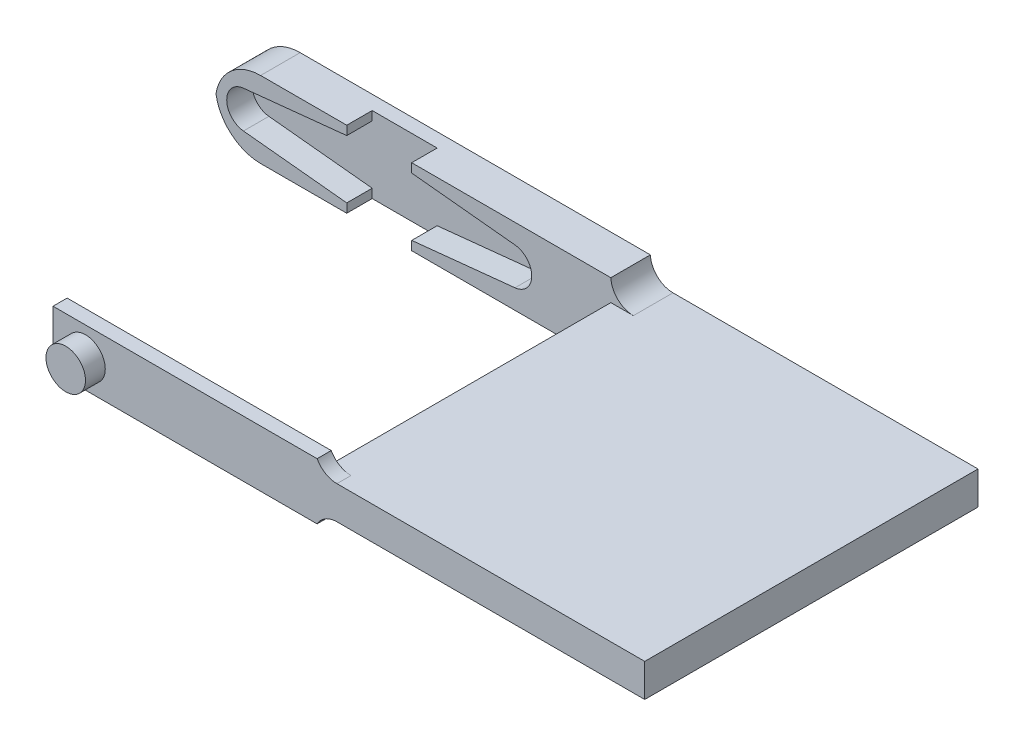
ISO-10303-21;
HEADER;
FILE_DESCRIPTION(('STEP AP214'),'2;1');
FILE_NAME('part.step','',(''),(''),'','','');
FILE_SCHEMA(('AUTOMOTIVE_DESIGN { 1 0 10303 214 1 1 1 1 }'));
ENDSEC;
DATA;
#1=APPLICATION_CONTEXT('core data for automotive mechanical design processes');
#2=APPLICATION_PROTOCOL_DEFINITION('international standard','automotive_design',2000,#1);
#3=PRODUCT_CONTEXT('',#1,'mechanical');
#4=PRODUCT('Part','Part','',(#3));
#5=PRODUCT_RELATED_PRODUCT_CATEGORY('part','',(#4));
#6=PRODUCT_DEFINITION_FORMATION('','',#4);
#7=PRODUCT_DEFINITION_CONTEXT('part definition',#1,'design');
#8=PRODUCT_DEFINITION('design','',#6,#7);
#9=PRODUCT_DEFINITION_SHAPE('','',#8);
#10=(LENGTH_UNIT() NAMED_UNIT(*) SI_UNIT(.MILLI.,.METRE.));
#11=(NAMED_UNIT(*) PLANE_ANGLE_UNIT() SI_UNIT($,.RADIAN.));
#12=(NAMED_UNIT(*) SI_UNIT($,.STERADIAN.) SOLID_ANGLE_UNIT());
#13=UNCERTAINTY_MEASURE_WITH_UNIT(LENGTH_MEASURE(1.E-05),#10,'distance_accuracy_value','');
#14=(GEOMETRIC_REPRESENTATION_CONTEXT(3) GLOBAL_UNCERTAINTY_ASSIGNED_CONTEXT((#13)) GLOBAL_UNIT_ASSIGNED_CONTEXT((#10,
#11,#12)) REPRESENTATION_CONTEXT('',''));
#15=CARTESIAN_POINT('',(0.,0.,0.));
#16=DIRECTION('',(0.,0.,1.));
#17=DIRECTION('',(1.,0.,0.));
#18=AXIS2_PLACEMENT_3D('',#15,#16,#17);
#19=CARTESIAN_POINT('',(0.,0.,3.5));
#20=DIRECTION('',(0.,0.,1.));
#21=DIRECTION('',(1.,0.,0.));
#22=AXIS2_PLACEMENT_3D('',#19,#20,#21);
#23=PLANE('',#22);
#24=DIRECTION('',(0.,1.,0.));
#25=VECTOR('',#24,1.);
#26=CARTESIAN_POINT('',(2.875,0.,3.5));
#27=LINE('',#26,#25);
#28=CARTESIAN_POINT('',(2.875,0.,3.5));
#29=VERTEX_POINT('',#28);
#30=CARTESIAN_POINT('',(2.875,0.795101343833628,3.5));
#31=VERTEX_POINT('',#30);
#32=EDGE_CURVE('E306',#29,#31,#27,.T.);
#33=ORIENTED_EDGE('',*,*,#32,.F.);
#34=DIRECTION('',(-1.,0.,0.));
#35=VECTOR('',#34,1.);
#36=CARTESIAN_POINT('',(0.,0.,3.5));
#37=LINE('',#36,#35);
#38=CARTESIAN_POINT('',(20.5,0.,3.5));
#39=VERTEX_POINT('',#38);
#40=EDGE_CURVE('E516',#39,#29,#37,.T.);
#41=ORIENTED_EDGE('',*,*,#40,.F.);
#42=CARTESIAN_POINT('',(22.4981037237807,-0.0870718612048299,3.5));
#43=DIRECTION('',(0.,0.,1.));
#44=DIRECTION('',(1.,0.,0.));
#45=AXIS2_PLACEMENT_3D('',#42,#43,#44);
#46=CIRCLE('',#45,2.);
#47=CARTESIAN_POINT('',(22.4981037237807,1.91292813879517,3.5));
#48=VERTEX_POINT('',#47);
#49=EDGE_CURVE('E392',#39,#48,#46,.F.);
#50=ORIENTED_EDGE('',*,*,#49,.T.);
#51=DIRECTION('',(1.,0.,0.));
#52=VECTOR('',#51,1.);
#53=CARTESIAN_POINT('',(0.,1.91292813879517,3.5));
#54=LINE('',#53,#52);
#55=CARTESIAN_POINT('',(20.5,1.91292813879517,3.5));
#56=VERTEX_POINT('',#55);
#57=EDGE_CURVE('E761',#56,#48,#54,.T.);
#58=ORIENTED_EDGE('',*,*,#57,.F.);
#59=DIRECTION('',(0.,-1.,0.));
#60=VECTOR('',#59,1.);
#61=CARTESIAN_POINT('',(20.5,0.,3.5));
#62=LINE('',#61,#60);
#63=CARTESIAN_POINT('',(20.5,4.83707186120483,3.5));
#64=VERTEX_POINT('',#63);
#65=EDGE_CURVE('E518',#64,#56,#62,.T.);
#66=ORIENTED_EDGE('',*,*,#65,.F.);
#67=DIRECTION('',(-1.,0.,0.));
#68=VECTOR('',#67,1.);
#69=CARTESIAN_POINT('',(0.,4.83707186120483,3.5));
#70=LINE('',#69,#68);
#71=CARTESIAN_POINT('',(22.4981037237807,4.83707186120483,3.5));
#72=VERTEX_POINT('',#71);
#73=EDGE_CURVE('E385',#72,#64,#70,.T.);
#74=ORIENTED_EDGE('',*,*,#73,.F.);
#75=CARTESIAN_POINT('',(22.4981037237807,6.83707186120483,3.5));
#76=DIRECTION('',(0.,0.,1.));
#77=DIRECTION('',(1.,0.,0.));
#78=AXIS2_PLACEMENT_3D('',#75,#76,#77);
#79=CIRCLE('',#78,2.);
#80=CARTESIAN_POINT('',(20.5,6.75,3.5));
#81=VERTEX_POINT('',#80);
#82=EDGE_CURVE('E396',#72,#81,#79,.F.);
#83=ORIENTED_EDGE('',*,*,#82,.T.);
#84=DIRECTION('',(1.,0.,0.));
#85=VECTOR('',#84,1.);
#86=CARTESIAN_POINT('',(0.,6.75,3.5));
#87=LINE('',#86,#85);
#88=CARTESIAN_POINT('',(2.875,6.75,3.5));
#89=VERTEX_POINT('',#88);
#90=EDGE_CURVE('E521',#89,#81,#87,.T.);
#91=ORIENTED_EDGE('',*,*,#90,.F.);
#92=DIRECTION('',(0.,1.,0.));
#93=VECTOR('',#92,1.);
#94=CARTESIAN_POINT('',(2.875,6.75,3.5));
#95=LINE('',#94,#93);
#96=CARTESIAN_POINT('',(2.875,5.95489865616637,3.5));
#97=VERTEX_POINT('',#96);
#98=EDGE_CURVE('E530',#97,#89,#95,.T.);
#99=ORIENTED_EDGE('',*,*,#98,.F.);
#100=DIRECTION('',(-0.994773374070749,0.102107464173283,0.));
#101=VECTOR('',#100,1.);
#102=CARTESIAN_POINT('',(0.634836166584157,6.18483791100064,3.5));
#103=LINE('',#102,#101);
#104=CARTESIAN_POINT('',(12.0184773158859,5.01637606721673,3.5));
#105=VERTEX_POINT('',#104);
#106=EDGE_CURVE('E335',#105,#97,#103,.T.);
#107=ORIENTED_EDGE('',*,*,#106,.F.);
#108=CARTESIAN_POINT('',(11.85,3.375,3.5));
#109=DIRECTION('',(0.,0.,1.));
#110=DIRECTION('',(1.,0.,0.));
#111=AXIS2_PLACEMENT_3D('',#108,#109,#110);
#112=CIRCLE('',#111,1.64999999999999);
#113=CARTESIAN_POINT('',(12.0184773158859,1.73362393278327,3.5));
#114=VERTEX_POINT('',#113);
#115=EDGE_CURVE('E328',#105,#114,#112,.F.);
#116=ORIENTED_EDGE('',*,*,#115,.T.);
#117=DIRECTION('',(-0.994773374070749,-0.102107464173284,0.));
#118=VECTOR('',#117,1.);
#119=CARTESIAN_POINT('',(-0.0507868933267326,0.49478703288005,3.5));
#120=LINE('',#119,#118);
#121=EDGE_CURVE('E322',#114,#31,#120,.T.);
#122=ORIENTED_EDGE('',*,*,#121,.T.);
#123=EDGE_LOOP('',(#33,#41,#50,#58,#66,#74,#83,#91,#99,#107,#116,#122));
#124=FACE_BOUND('',#123,.T.);
#125=ADVANCED_FACE('F115',(#124),#23,.T.);
#126=CARTESIAN_POINT('',(0.,0.,29.5));
#127=DIRECTION('',(0.,0.,1.));
#128=DIRECTION('',(1.,0.,0.));
#129=AXIS2_PLACEMENT_3D('',#126,#127,#128);
#130=PLANE('',#129);
#131=DIRECTION('',(1.,0.,0.));
#132=VECTOR('',#131,1.);
#133=CARTESIAN_POINT('',(0.,4.83707186120483,29.5));
#134=LINE('',#133,#132);
#135=CARTESIAN_POINT('',(22.2534017605437,4.83707186120483,29.5));
#136=VERTEX_POINT('',#135);
#137=CARTESIAN_POINT('',(49.5,4.83707186120483,29.5));
#138=VERTEX_POINT('',#137);
#139=EDGE_CURVE('E479',#136,#138,#134,.T.);
#140=ORIENTED_EDGE('',*,*,#139,.F.);
#141=CARTESIAN_POINT('',(22.2534017605437,6.83707186120483,29.5));
#142=DIRECTION('',(0.,0.,1.));
#143=DIRECTION('',(1.,0.,0.));
#144=AXIS2_PLACEMENT_3D('',#141,#142,#143);
#145=CIRCLE('',#144,2.);
#146=CARTESIAN_POINT('',(20.5,5.875,29.5));
#147=VERTEX_POINT('',#146);
#148=EDGE_CURVE('E405',#136,#147,#145,.F.);
#149=ORIENTED_EDGE('',*,*,#148,.T.);
#150=DIRECTION('',(-1.,0.,0.));
#151=VECTOR('',#150,1.);
#152=CARTESIAN_POINT('',(14.5,5.875,29.5));
#153=LINE('',#152,#151);
#154=CARTESIAN_POINT('',(-2.875,5.87499999999999,29.5));
#155=VERTEX_POINT('',#154);
#156=EDGE_CURVE('E455',#147,#155,#153,.T.);
#157=ORIENTED_EDGE('',*,*,#156,.T.);
#158=DIRECTION('',(0.,-1.,0.));
#159=VECTOR('',#158,1.);
#160=CARTESIAN_POINT('',(-2.875,5.87499999999999,29.5));
#161=LINE('',#160,#159);
#162=CARTESIAN_POINT('',(-2.875,0.874999999999995,29.5));
#163=VERTEX_POINT('',#162);
#164=EDGE_CURVE('E466',#155,#163,#161,.T.);
#165=ORIENTED_EDGE('',*,*,#164,.T.);
#166=DIRECTION('',(-1.,0.,0.));
#167=VECTOR('',#166,1.);
#168=CARTESIAN_POINT('',(14.5,0.874999999999996,29.5));
#169=LINE('',#168,#167);
#170=CARTESIAN_POINT('',(20.5,0.875,29.5));
#171=VERTEX_POINT('',#170);
#172=EDGE_CURVE('E449',#171,#163,#169,.T.);
#173=ORIENTED_EDGE('',*,*,#172,.F.);
#174=CARTESIAN_POINT('',(22.2534017605437,-0.0870718612048299,29.5));
#175=DIRECTION('',(0.,0.,1.));
#176=DIRECTION('',(1.,0.,0.));
#177=AXIS2_PLACEMENT_3D('',#174,#175,#176);
#178=CIRCLE('',#177,2.);
#179=CARTESIAN_POINT('',(22.2534017605437,1.91292813879517,29.5));
#180=VERTEX_POINT('',#179);
#181=EDGE_CURVE('E401',#171,#180,#178,.F.);
#182=ORIENTED_EDGE('',*,*,#181,.T.);
#183=DIRECTION('',(1.,0.,0.));
#184=VECTOR('',#183,1.);
#185=CARTESIAN_POINT('',(0.,1.91292813879517,29.5));
#186=LINE('',#185,#184);
#187=CARTESIAN_POINT('',(49.5,1.91292813879517,29.5));
#188=VERTEX_POINT('',#187);
#189=EDGE_CURVE('E481',#180,#188,#186,.T.);
#190=ORIENTED_EDGE('',*,*,#189,.T.);
#191=DIRECTION('',(0.,-1.,0.));
#192=VECTOR('',#191,1.);
#193=CARTESIAN_POINT('',(49.5,0.,29.5));
#194=LINE('',#193,#192);
#195=EDGE_CURVE('E484',#138,#188,#194,.T.);
#196=ORIENTED_EDGE('',*,*,#195,.F.);
#197=EDGE_LOOP('',(#140,#149,#157,#165,#173,#182,#190,#196));
#198=FACE_BOUND('',#197,.T.);
#199=CARTESIAN_POINT('',(0.,3.375,29.5));
#200=DIRECTION('',(0.,0.,1.));
#201=DIRECTION('',(1.,0.,0.));
#202=AXIS2_PLACEMENT_3D('',#199,#200,#201);
#203=CIRCLE('',#202,1.75);
#204=CARTESIAN_POINT('',(1.75,3.375,29.5));
#205=VERTEX_POINT('',#204);
#206=EDGE_CURVE('E433',#205,#205,#203,.T.);
#207=ORIENTED_EDGE('',*,*,#206,.F.);
#208=EDGE_LOOP('',(#207));
#209=FACE_BOUND('',#208,.T.);
#210=ADVANCED_FACE('F572',(#198,#209),#130,.T.);
#211=CARTESIAN_POINT('',(0.634836166584157,6.18483791100064,3.5));
#212=DIRECTION('',(-0.102107464173283,-0.994773374070749,0.));
#213=DIRECTION('',(0.994773374070749,-0.102107464173283,0.));
#214=AXIS2_PLACEMENT_3D('',#211,#212,#213);
#215=PLANE('',#214);
#216=DIRECTION('',(0.,0.,1.));
#217=VECTOR('',#216,1.);
#218=CARTESIAN_POINT('',(2.875,5.95489865616637,-4.55471240863542));
#219=LINE('',#218,#217);
#220=CARTESIAN_POINT('',(2.875,5.95489865616637,1.25));
#221=VERTEX_POINT('',#220);
#222=EDGE_CURVE('E527',#221,#97,#219,.T.);
#223=ORIENTED_EDGE('',*,*,#222,.F.);
#224=DIRECTION('',(-0.994773374070749,0.102107464173283,0.));
#225=VECTOR('',#224,1.);
#226=CARTESIAN_POINT('',(0.634836166584157,6.18483791100064,1.25));
#227=LINE('',#226,#225);
#228=CARTESIAN_POINT('',(12.0184773158859,5.01637606721673,1.25));
#229=VERTEX_POINT('',#228);
#230=EDGE_CURVE('E504',#229,#221,#227,.T.);
#231=ORIENTED_EDGE('',*,*,#230,.F.);
#232=DIRECTION('',(0.,0.,-1.));
#233=VECTOR('',#232,1.);
#234=CARTESIAN_POINT('',(12.0184773158859,5.01637606721673,3.5));
#235=LINE('',#234,#233);
#236=EDGE_CURVE('E360',#105,#229,#235,.T.);
#237=ORIENTED_EDGE('',*,*,#236,.F.);
#238=ORIENTED_EDGE('',*,*,#106,.T.);
#239=EDGE_LOOP('',(#223,#231,#237,#238));
#240=FACE_BOUND('',#239,.T.);
#241=ADVANCED_FACE('F525',(#240),#215,.T.);
#242=CARTESIAN_POINT('',(11.85,3.375,3.5));
#243=DIRECTION('',(0.,0.,-1.));
#244=DIRECTION('',(-1.,0.,0.));
#245=AXIS2_PLACEMENT_3D('',#242,#243,#244);
#246=CYLINDRICAL_SURFACE('',#245,1.64999999999999);
#247=ORIENTED_EDGE('',*,*,#236,.T.);
#248=CARTESIAN_POINT('',(11.85,3.375,1.25));
#249=DIRECTION('',(0.,0.,1.));
#250=DIRECTION('',(1.,0.,0.));
#251=AXIS2_PLACEMENT_3D('',#248,#249,#250);
#252=CIRCLE('',#251,1.64999999999999);
#253=CARTESIAN_POINT('',(12.0184773158859,1.73362393278327,1.25));
#254=VERTEX_POINT('',#253);
#255=EDGE_CURVE('E501',#229,#254,#252,.F.);
#256=ORIENTED_EDGE('',*,*,#255,.T.);
#257=DIRECTION('',(0.,0.,-1.));
#258=VECTOR('',#257,1.);
#259=CARTESIAN_POINT('',(12.0184773158859,1.73362393278327,3.5));
#260=LINE('',#259,#258);
#261=EDGE_CURVE('E358',#114,#254,#260,.T.);
#262=ORIENTED_EDGE('',*,*,#261,.F.);
#263=ORIENTED_EDGE('',*,*,#115,.F.);
#264=EDGE_LOOP('',(#247,#256,#262,#263));
#265=FACE_BOUND('',#264,.T.);
#266=ADVANCED_FACE('F564',(#265),#246,.F.);
#267=CARTESIAN_POINT('',(-0.0507868933267326,0.49478703288005,3.5));
#268=DIRECTION('',(0.102107464173283,-0.994773374070749,0.));
#269=DIRECTION('',(0.994773374070749,0.102107464173284,0.));
#270=AXIS2_PLACEMENT_3D('',#267,#268,#269);
#271=PLANE('',#270);
#272=DIRECTION('',(-0.994773374070749,-0.102107464173284,0.));
#273=VECTOR('',#272,1.);
#274=CARTESIAN_POINT('',(-0.0507868933267326,0.49478703288005,1.25));
#275=LINE('',#274,#273);
#276=CARTESIAN_POINT('',(2.875,0.795101343833628,1.25));
#277=VERTEX_POINT('',#276);
#278=EDGE_CURVE('E324',#254,#277,#275,.T.);
#279=ORIENTED_EDGE('',*,*,#278,.T.);
#280=DIRECTION('',(0.,0.,1.));
#281=VECTOR('',#280,1.);
#282=CARTESIAN_POINT('',(2.875,0.795101343833628,-4.55471240863542));
#283=LINE('',#282,#281);
#284=EDGE_CURVE('E309',#277,#31,#283,.T.);
#285=ORIENTED_EDGE('',*,*,#284,.T.);
#286=ORIENTED_EDGE('',*,*,#121,.F.);
#287=ORIENTED_EDGE('',*,*,#261,.T.);
#288=EDGE_LOOP('',(#279,#285,#286,#287));
#289=FACE_BOUND('',#288,.T.);
#290=ADVANCED_FACE('F320',(#289),#271,.F.);
#291=CARTESIAN_POINT('',(0.0507868933267324,0.49478703288005,3.5));
#292=DIRECTION('',(0.102107464173283,0.994773374070749,0.));
#293=DIRECTION('',(-0.994773374070749,0.102107464173283,0.));
#294=AXIS2_PLACEMENT_3D('',#291,#292,#293);
#295=PLANE('',#294);
#296=DIRECTION('',(0.,0.,1.));
#297=VECTOR('',#296,1.);
#298=CARTESIAN_POINT('',(-2.875,0.795101343833628,-4.55471240863542));
#299=LINE('',#298,#297);
#300=CARTESIAN_POINT('',(-2.875,0.795101343833628,1.25));
#301=VERTEX_POINT('',#300);
#302=CARTESIAN_POINT('',(-2.87500000000002,0.795101343833628,3.5));
#303=VERTEX_POINT('',#302);
#304=EDGE_CURVE('E131',#301,#303,#299,.T.);
#305=ORIENTED_EDGE('',*,*,#304,.F.);
#306=DIRECTION('',(0.994773374070749,-0.102107464173283,0.));
#307=VECTOR('',#306,1.);
#308=CARTESIAN_POINT('',(0.0507868933267324,0.49478703288005,1.25));
#309=LINE('',#308,#307);
#310=CARTESIAN_POINT('',(-12.0184773158859,1.73362393278327,1.25));
#311=VERTEX_POINT('',#310);
#312=EDGE_CURVE('E512',#311,#301,#309,.T.);
#313=ORIENTED_EDGE('',*,*,#312,.F.);
#314=DIRECTION('',(0.,0.,-1.));
#315=VECTOR('',#314,1.);
#316=CARTESIAN_POINT('',(-12.0184773158859,1.73362393278327,3.5));
#317=LINE('',#316,#315);
#318=CARTESIAN_POINT('',(-12.0184773158859,1.73362393278327,3.5));
#319=VERTEX_POINT('',#318);
#320=EDGE_CURVE('E354',#319,#311,#317,.T.);
#321=ORIENTED_EDGE('',*,*,#320,.F.);
#322=DIRECTION('',(0.994773374070749,-0.102107464173283,0.));
#323=VECTOR('',#322,1.);
#324=CARTESIAN_POINT('',(0.0507868933267324,0.49478703288005,3.5));
#325=LINE('',#324,#323);
#326=EDGE_CURVE('E330',#319,#303,#325,.T.);
#327=ORIENTED_EDGE('',*,*,#326,.T.);
#328=EDGE_LOOP('',(#305,#313,#321,#327));
#329=FACE_BOUND('',#328,.T.);
#330=ADVANCED_FACE('F555',(#329),#295,.T.);
#331=CARTESIAN_POINT('',(-11.85,3.375,3.5));
#332=DIRECTION('',(0.,0.,-1.));
#333=DIRECTION('',(-1.,0.,0.));
#334=AXIS2_PLACEMENT_3D('',#331,#332,#333);
#335=CYLINDRICAL_SURFACE('',#334,1.65);
#336=CARTESIAN_POINT('',(-11.85,3.375,1.25));
#337=DIRECTION('',(0.,0.,1.));
#338=DIRECTION('',(1.,0.,0.));
#339=AXIS2_PLACEMENT_3D('',#336,#337,#338);
#340=CIRCLE('',#339,1.65);
#341=CARTESIAN_POINT('',(-12.0184773158859,5.01637606721673,1.25));
#342=VERTEX_POINT('',#341);
#343=EDGE_CURVE('E510',#342,#311,#340,.T.);
#344=ORIENTED_EDGE('',*,*,#343,.F.);
#345=DIRECTION('',(0.,0.,-1.));
#346=VECTOR('',#345,1.);
#347=CARTESIAN_POINT('',(-12.0184773158859,5.01637606721673,3.5));
#348=LINE('',#347,#346);
#349=CARTESIAN_POINT('',(-12.0184773158859,5.01637606721673,3.5));
#350=VERTEX_POINT('',#349);
#351=EDGE_CURVE('E351',#350,#342,#348,.T.);
#352=ORIENTED_EDGE('',*,*,#351,.F.);
#353=CARTESIAN_POINT('',(-11.85,3.375,3.5));
#354=DIRECTION('',(0.,0.,1.));
#355=DIRECTION('',(1.,0.,0.));
#356=AXIS2_PLACEMENT_3D('',#353,#354,#355);
#357=CIRCLE('',#356,1.65);
#358=EDGE_CURVE('E333',#350,#319,#357,.T.);
#359=ORIENTED_EDGE('',*,*,#358,.T.);
#360=ORIENTED_EDGE('',*,*,#320,.T.);
#361=EDGE_LOOP('',(#344,#352,#359,#360));
#362=FACE_BOUND('',#361,.T.);
#363=ADVANCED_FACE('F550',(#362),#335,.F.);
#364=CARTESIAN_POINT('',(0.,0.,3.5));
#365=DIRECTION('',(0.,-1.,0.));
#366=DIRECTION('',(1.,0.,0.));
#367=AXIS2_PLACEMENT_3D('',#364,#365,#366);
#368=PLANE('',#367);
#369=DIRECTION('',(0.,0.,1.));
#370=VECTOR('',#369,1.);
#371=CARTESIAN_POINT('',(2.875,0.,-4.55471240863542));
#372=LINE('',#371,#370);
#373=CARTESIAN_POINT('',(2.875,0.,1.25));
#374=VERTEX_POINT('',#373);
#375=EDGE_CURVE('E312',#374,#29,#372,.T.);
#376=ORIENTED_EDGE('',*,*,#375,.F.);
#377=DIRECTION('',(-1.,0.,0.));
#378=VECTOR('',#377,1.);
#379=CARTESIAN_POINT('',(-2.875,0.,1.25));
#380=LINE('',#379,#378);
#381=CARTESIAN_POINT('',(-2.875,0.,1.25));
#382=VERTEX_POINT('',#381);
#383=EDGE_CURVE('E775',#374,#382,#380,.T.);
#384=ORIENTED_EDGE('',*,*,#383,.T.);
#385=DIRECTION('',(0.,0.,1.));
#386=VECTOR('',#385,1.);
#387=CARTESIAN_POINT('',(-2.875,0.,-4.55471240863542));
#388=LINE('',#387,#386);
#389=CARTESIAN_POINT('',(-2.875,0.,3.5));
#390=VERTEX_POINT('',#389);
#391=EDGE_CURVE('E556',#382,#390,#388,.T.);
#392=ORIENTED_EDGE('',*,*,#391,.T.);
#393=CARTESIAN_POINT('',(-10.5,0.,3.5));
#394=VERTEX_POINT('',#393);
#395=EDGE_CURVE('E350',#390,#394,#37,.T.);
#396=ORIENTED_EDGE('',*,*,#395,.T.);
#397=DIRECTION('',(0.,0.,-1.));
#398=VECTOR('',#397,1.);
#399=CARTESIAN_POINT('',(-10.5,0.,3.5));
#400=LINE('',#399,#398);
#401=CARTESIAN_POINT('',(-10.5,0.,0.));
#402=VERTEX_POINT('',#401);
#403=EDGE_CURVE('E12',#394,#402,#400,.T.);
#404=ORIENTED_EDGE('',*,*,#403,.T.);
#405=DIRECTION('',(-1.,0.,0.));
#406=VECTOR('',#405,1.);
#407=CARTESIAN_POINT('',(0.,0.,0.));
#408=LINE('',#407,#406);
#409=CARTESIAN_POINT('',(20.5,0.,0.));
#410=VERTEX_POINT('',#409);
#411=EDGE_CURVE('E345',#410,#402,#408,.T.);
#412=ORIENTED_EDGE('',*,*,#411,.F.);
#413=DIRECTION('',(0.,0.,-1.));
#414=VECTOR('',#413,1.);
#415=CARTESIAN_POINT('',(20.5,0.,3.5));
#416=LINE('',#415,#414);
#417=EDGE_CURVE('E355',#39,#410,#416,.T.);
#418=ORIENTED_EDGE('',*,*,#417,.F.);
#419=ORIENTED_EDGE('',*,*,#40,.T.);
#420=EDGE_LOOP('',(#376,#384,#392,#396,#404,#412,#418,#419));
#421=FACE_BOUND('',#420,.T.);
#422=ADVANCED_FACE('F595',(#421),#368,.T.);
#423=CARTESIAN_POINT('',(0.,6.75,3.5));
#424=DIRECTION('',(0.,1.,0.));
#425=DIRECTION('',(0.,0.,1.));
#426=AXIS2_PLACEMENT_3D('',#423,#424,#425);
#427=PLANE('',#426);
#428=DIRECTION('',(0.,0.,1.));
#429=VECTOR('',#428,1.);
#430=CARTESIAN_POINT('',(2.875,6.75,-4.55471240863542));
#431=LINE('',#430,#429);
#432=CARTESIAN_POINT('',(2.875,6.75,1.25));
#433=VERTEX_POINT('',#432);
#434=EDGE_CURVE('E540',#433,#89,#431,.T.);
#435=ORIENTED_EDGE('',*,*,#434,.T.);
#436=ORIENTED_EDGE('',*,*,#90,.T.);
#437=DIRECTION('',(0.,0.,-1.));
#438=VECTOR('',#437,1.);
#439=CARTESIAN_POINT('',(20.5,6.75,3.5));
#440=LINE('',#439,#438);
#441=CARTESIAN_POINT('',(20.5,6.75,0.));
#442=VERTEX_POINT('',#441);
#443=EDGE_CURVE('E344',#81,#442,#440,.T.);
#444=ORIENTED_EDGE('',*,*,#443,.T.);
#445=DIRECTION('',(1.,0.,0.));
#446=VECTOR('',#445,1.);
#447=CARTESIAN_POINT('',(0.,6.75,0.));
#448=LINE('',#447,#446);
#449=CARTESIAN_POINT('',(-10.5,6.75,0.));
#450=VERTEX_POINT('',#449);
#451=EDGE_CURVE('E348',#450,#442,#448,.T.);
#452=ORIENTED_EDGE('',*,*,#451,.F.);
#453=DIRECTION('',(0.,0.,-1.));
#454=VECTOR('',#453,1.);
#455=CARTESIAN_POINT('',(-10.5,6.75,3.5));
#456=LINE('',#455,#454);
#457=CARTESIAN_POINT('',(-10.5,6.75,3.5));
#458=VERTEX_POINT('',#457);
#459=EDGE_CURVE('E411',#450,#458,#456,.F.);
#460=ORIENTED_EDGE('',*,*,#459,.T.);
#461=CARTESIAN_POINT('',(-2.875,6.75,3.5));
#462=VERTEX_POINT('',#461);
#463=EDGE_CURVE('E424',#458,#462,#87,.T.);
#464=ORIENTED_EDGE('',*,*,#463,.T.);
#465=DIRECTION('',(0.,0.,1.));
#466=VECTOR('',#465,1.);
#467=CARTESIAN_POINT('',(-2.875,6.75,-4.55471240863542));
#468=LINE('',#467,#466);
#469=CARTESIAN_POINT('',(-2.875,6.75,1.25));
#470=VERTEX_POINT('',#469);
#471=EDGE_CURVE('E139',#470,#462,#468,.T.);
#472=ORIENTED_EDGE('',*,*,#471,.F.);
#473=DIRECTION('',(1.,0.,0.));
#474=VECTOR('',#473,1.);
#475=CARTESIAN_POINT('',(-2.875,6.75,1.25));
#476=LINE('',#475,#474);
#477=EDGE_CURVE('E438',#470,#433,#476,.T.);
#478=ORIENTED_EDGE('',*,*,#477,.T.);
#479=EDGE_LOOP('',(#435,#436,#444,#452,#460,#464,#472,#478));
#480=FACE_BOUND('',#479,.T.);
#481=ADVANCED_FACE('F590',(#480),#427,.T.);
#482=CARTESIAN_POINT('',(-0.634836166584157,6.18483791100064,3.5));
#483=DIRECTION('',(-0.102107464173283,0.994773374070749,0.));
#484=DIRECTION('',(-0.994773374070749,-0.102107464173283,0.));
#485=AXIS2_PLACEMENT_3D('',#482,#483,#484);
#486=PLANE('',#485);
#487=DIRECTION('',(0.994773374070749,0.102107464173283,0.));
#488=VECTOR('',#487,1.);
#489=CARTESIAN_POINT('',(-0.634836166584157,6.18483791100064,1.25));
#490=LINE('',#489,#488);
#491=CARTESIAN_POINT('',(-2.875,5.95489865616637,1.25));
#492=VERTEX_POINT('',#491);
#493=EDGE_CURVE('E507',#342,#492,#490,.T.);
#494=ORIENTED_EDGE('',*,*,#493,.T.);
#495=DIRECTION('',(0.,0.,1.));
#496=VECTOR('',#495,1.);
#497=CARTESIAN_POINT('',(-2.875,5.95489865616637,-4.55471240863542));
#498=LINE('',#497,#496);
#499=CARTESIAN_POINT('',(-2.875,5.95489865616637,3.5));
#500=VERTEX_POINT('',#499);
#501=EDGE_CURVE('E536',#492,#500,#498,.T.);
#502=ORIENTED_EDGE('',*,*,#501,.T.);
#503=DIRECTION('',(0.994773374070749,0.102107464173283,0.));
#504=VECTOR('',#503,1.);
#505=CARTESIAN_POINT('',(-0.634836166584157,6.18483791100064,3.5));
#506=LINE('',#505,#504);
#507=EDGE_CURVE('E341',#350,#500,#506,.T.);
#508=ORIENTED_EDGE('',*,*,#507,.F.);
#509=ORIENTED_EDGE('',*,*,#351,.T.);
#510=EDGE_LOOP('',(#494,#502,#508,#509));
#511=FACE_BOUND('',#510,.T.);
#512=ADVANCED_FACE('F545',(#511),#486,.F.);
#513=DIRECTION('',(0.,-1.,0.));
#514=VECTOR('',#513,1.);
#515=CARTESIAN_POINT('',(-2.875,0.,3.5));
#516=LINE('',#515,#514);
#517=EDGE_CURVE('E317',#303,#390,#516,.T.);
#518=ORIENTED_EDGE('',*,*,#517,.F.);
#519=ORIENTED_EDGE('',*,*,#326,.F.);
#520=ORIENTED_EDGE('',*,*,#358,.F.);
#521=ORIENTED_EDGE('',*,*,#507,.T.);
#522=DIRECTION('',(0.,-1.,0.));
#523=VECTOR('',#522,1.);
#524=CARTESIAN_POINT('',(-2.875,6.75,3.5));
#525=LINE('',#524,#523);
#526=EDGE_CURVE('E534',#462,#500,#525,.T.);
#527=ORIENTED_EDGE('',*,*,#526,.F.);
#528=ORIENTED_EDGE('',*,*,#463,.F.);
#529=CARTESIAN_POINT('',(-10.5,2.75,3.5));
#530=DIRECTION('',(0.,0.,1.));
#531=DIRECTION('',(1.,0.,0.));
#532=AXIS2_PLACEMENT_3D('',#529,#530,#531);
#533=CIRCLE('',#532,4.);
#534=CARTESIAN_POINT('',(-14.4508701573198,3.375,3.5));
#535=VERTEX_POINT('',#534);
#536=EDGE_CURVE('E124',#458,#535,#533,.T.);
#537=ORIENTED_EDGE('',*,*,#536,.T.);
#538=CARTESIAN_POINT('',(-10.5,4.,3.5));
#539=DIRECTION('',(0.,0.,1.));
#540=DIRECTION('',(1.,0.,0.));
#541=AXIS2_PLACEMENT_3D('',#538,#539,#540);
#542=CIRCLE('',#541,4.);
#543=EDGE_CURVE('E414',#535,#394,#542,.T.);
#544=ORIENTED_EDGE('',*,*,#543,.T.);
#545=ORIENTED_EDGE('',*,*,#395,.F.);
#546=EDGE_LOOP('',(#518,#519,#520,#521,#527,#528,#537,#544,#545));
#547=FACE_BOUND('',#546,.T.);
#548=ADVANCED_FACE('F420',(#547),#23,.T.);
#549=CARTESIAN_POINT('',(0.,0.,0.));
#550=DIRECTION('',(0.,0.,1.));
#551=DIRECTION('',(1.,0.,0.));
#552=AXIS2_PLACEMENT_3D('',#549,#550,#551);
#553=PLANE('',#552);
#554=CARTESIAN_POINT('',(-10.5,4.,0.));
#555=DIRECTION('',(0.,0.,1.));
#556=DIRECTION('',(1.,0.,0.));
#557=AXIS2_PLACEMENT_3D('',#554,#555,#556);
#558=CIRCLE('',#557,4.);
#559=CARTESIAN_POINT('',(-14.4508701573198,3.375,0.));
#560=VERTEX_POINT('',#559);
#561=EDGE_CURVE('E407',#402,#560,#558,.F.);
#562=ORIENTED_EDGE('',*,*,#561,.T.);
#563=CARTESIAN_POINT('',(-10.5,2.75,0.));
#564=DIRECTION('',(0.,0.,1.));
#565=DIRECTION('',(1.,0.,0.));
#566=AXIS2_PLACEMENT_3D('',#563,#564,#565);
#567=CIRCLE('',#566,4.);
#568=EDGE_CURVE('E409',#560,#450,#567,.F.);
#569=ORIENTED_EDGE('',*,*,#568,.T.);
#570=ORIENTED_EDGE('',*,*,#451,.T.);
#571=CARTESIAN_POINT('',(22.4981037237807,6.83707186120483,0.));
#572=DIRECTION('',(0.,0.,1.));
#573=DIRECTION('',(1.,0.,0.));
#574=AXIS2_PLACEMENT_3D('',#571,#572,#573);
#575=CIRCLE('',#574,2.);
#576=CARTESIAN_POINT('',(22.4981037237807,4.83707186120483,0.));
#577=VERTEX_POINT('',#576);
#578=EDGE_CURVE('E394',#442,#577,#575,.T.);
#579=ORIENTED_EDGE('',*,*,#578,.T.);
#580=DIRECTION('',(1.,0.,0.));
#581=VECTOR('',#580,1.);
#582=CARTESIAN_POINT('',(0.,4.83707186120483,0.));
#583=LINE('',#582,#581);
#584=CARTESIAN_POINT('',(49.5,4.83707186120483,0.));
#585=VERTEX_POINT('',#584);
#586=EDGE_CURVE('E373',#577,#585,#583,.T.);
#587=ORIENTED_EDGE('',*,*,#586,.T.);
#588=DIRECTION('',(0.,-1.,0.));
#589=VECTOR('',#588,1.);
#590=CARTESIAN_POINT('',(49.5,0.,0.));
#591=LINE('',#590,#589);
#592=CARTESIAN_POINT('',(49.5,1.91292813879517,0.));
#593=VERTEX_POINT('',#592);
#594=EDGE_CURVE('E482',#585,#593,#591,.T.);
#595=ORIENTED_EDGE('',*,*,#594,.T.);
#596=DIRECTION('',(1.,0.,0.));
#597=VECTOR('',#596,1.);
#598=CARTESIAN_POINT('',(0.,1.91292813879517,0.));
#599=LINE('',#598,#597);
#600=CARTESIAN_POINT('',(22.4981037237807,1.91292813879517,0.));
#601=VERTEX_POINT('',#600);
#602=EDGE_CURVE('E376',#601,#593,#599,.T.);
#603=ORIENTED_EDGE('',*,*,#602,.F.);
#604=CARTESIAN_POINT('',(22.4981037237807,-0.0870718612048299,0.));
#605=DIRECTION('',(0.,0.,1.));
#606=DIRECTION('',(1.,0.,0.));
#607=AXIS2_PLACEMENT_3D('',#604,#605,#606);
#608=CIRCLE('',#607,2.);
#609=EDGE_CURVE('E390',#601,#410,#608,.T.);
#610=ORIENTED_EDGE('',*,*,#609,.T.);
#611=ORIENTED_EDGE('',*,*,#411,.T.);
#612=EDGE_LOOP('',(#562,#569,#570,#579,#587,#595,#603,#610,#611));
#613=FACE_BOUND('',#612,.T.);
#614=ADVANCED_FACE('F584',(#613),#553,.F.);
#615=CARTESIAN_POINT('',(0.,0.,1.25));
#616=DIRECTION('',(0.,0.,1.));
#617=DIRECTION('',(1.,0.,0.));
#618=AXIS2_PLACEMENT_3D('',#615,#616,#617);
#619=PLANE('',#618);
#620=ORIENTED_EDGE('',*,*,#312,.T.);
#621=DIRECTION('',(0.,1.,0.));
#622=VECTOR('',#621,1.);
#623=CARTESIAN_POINT('',(-2.875,0.,1.25));
#624=LINE('',#623,#622);
#625=EDGE_CURVE('E776',#382,#301,#624,.T.);
#626=ORIENTED_EDGE('',*,*,#625,.F.);
#627=ORIENTED_EDGE('',*,*,#383,.F.);
#628=DIRECTION('',(0.,-1.,0.));
#629=VECTOR('',#628,1.);
#630=CARTESIAN_POINT('',(2.875,0.,1.25));
#631=LINE('',#630,#629);
#632=EDGE_CURVE('E537',#277,#374,#631,.T.);
#633=ORIENTED_EDGE('',*,*,#632,.F.);
#634=ORIENTED_EDGE('',*,*,#278,.F.);
#635=ORIENTED_EDGE('',*,*,#255,.F.);
#636=ORIENTED_EDGE('',*,*,#230,.T.);
#637=DIRECTION('',(0.,-1.,0.));
#638=VECTOR('',#637,1.);
#639=CARTESIAN_POINT('',(2.875,6.75,1.25));
#640=LINE('',#639,#638);
#641=EDGE_CURVE('E443',#433,#221,#640,.T.);
#642=ORIENTED_EDGE('',*,*,#641,.F.);
#643=ORIENTED_EDGE('',*,*,#477,.F.);
#644=DIRECTION('',(0.,1.,0.));
#645=VECTOR('',#644,1.);
#646=CARTESIAN_POINT('',(-2.875,6.75,1.25));
#647=LINE('',#646,#645);
#648=EDGE_CURVE('E434',#492,#470,#647,.T.);
#649=ORIENTED_EDGE('',*,*,#648,.F.);
#650=ORIENTED_EDGE('',*,*,#493,.F.);
#651=ORIENTED_EDGE('',*,*,#343,.T.);
#652=EDGE_LOOP('',(#620,#626,#627,#633,#634,#635,#636,#642,#643,#649,#650,#651));
#653=FACE_BOUND('',#652,.T.);
#654=ADVANCED_FACE('F553',(#653),#619,.T.);
#655=CARTESIAN_POINT('',(20.5,0.,29.5));
#656=DIRECTION('',(1.,0.,0.));
#657=DIRECTION('',(0.,0.,-1.));
#658=AXIS2_PLACEMENT_3D('',#655,#656,#657);
#659=PLANE('',#658);
#660=DIRECTION('',(0.,0.,-1.));
#661=VECTOR('',#660,1.);
#662=CARTESIAN_POINT('',(20.5,1.91292813879517,29.5));
#663=LINE('',#662,#661);
#664=CARTESIAN_POINT('',(20.5,1.91292813879517,28.25));
#665=VERTEX_POINT('',#664);
#666=EDGE_CURVE('E495',#665,#56,#663,.T.);
#667=ORIENTED_EDGE('',*,*,#666,.F.);
#668=DIRECTION('',(0.,-1.,0.));
#669=VECTOR('',#668,1.);
#670=CARTESIAN_POINT('',(20.5,5.875,28.25));
#671=LINE('',#670,#669);
#672=CARTESIAN_POINT('',(20.5,4.83707186120483,28.25));
#673=VERTEX_POINT('',#672);
#674=EDGE_CURVE('E454',#673,#665,#671,.T.);
#675=ORIENTED_EDGE('',*,*,#674,.F.);
#676=DIRECTION('',(0.,0.,-1.));
#677=VECTOR('',#676,1.);
#678=CARTESIAN_POINT('',(20.5,4.83707186120483,29.5));
#679=LINE('',#678,#677);
#680=EDGE_CURVE('E498',#673,#64,#679,.T.);
#681=ORIENTED_EDGE('',*,*,#680,.T.);
#682=ORIENTED_EDGE('',*,*,#65,.T.);
#683=EDGE_LOOP('',(#667,#675,#681,#682));
#684=FACE_BOUND('',#683,.T.);
#685=ADVANCED_FACE('F643',(#684),#659,.F.);
#686=CARTESIAN_POINT('',(0.,4.83707186120483,29.5));
#687=DIRECTION('',(0.,1.,0.));
#688=DIRECTION('',(0.,0.,1.));
#689=AXIS2_PLACEMENT_3D('',#686,#687,#688);
#690=PLANE('',#689);
#691=ORIENTED_EDGE('',*,*,#586,.F.);
#692=DIRECTION('',(0.,0.,-1.));
#693=VECTOR('',#692,1.);
#694=CARTESIAN_POINT('',(22.4981037237807,4.83707186120483,3.5));
#695=LINE('',#694,#693);
#696=EDGE_CURVE('E387',#577,#72,#695,.F.);
#697=ORIENTED_EDGE('',*,*,#696,.T.);
#698=ORIENTED_EDGE('',*,*,#73,.T.);
#699=ORIENTED_EDGE('',*,*,#680,.F.);
#700=DIRECTION('',(1.,0.,0.));
#701=VECTOR('',#700,1.);
#702=CARTESIAN_POINT('',(0.,4.83707186120483,28.25));
#703=LINE('',#702,#701);
#704=CARTESIAN_POINT('',(22.2534017605437,4.83707186120483,28.25));
#705=VERTEX_POINT('',#704);
#706=EDGE_CURVE('E382',#673,#705,#703,.T.);
#707=ORIENTED_EDGE('',*,*,#706,.T.);
#708=DIRECTION('',(0.,0.,1.));
#709=VECTOR('',#708,1.);
#710=CARTESIAN_POINT('',(22.2534017605437,4.83707186120483,29.5));
#711=LINE('',#710,#709);
#712=EDGE_CURVE('E380',#705,#136,#711,.T.);
#713=ORIENTED_EDGE('',*,*,#712,.T.);
#714=ORIENTED_EDGE('',*,*,#139,.T.);
#715=DIRECTION('',(0.,0.,-1.));
#716=VECTOR('',#715,1.);
#717=CARTESIAN_POINT('',(49.5,4.83707186120483,29.5));
#718=LINE('',#717,#716);
#719=EDGE_CURVE('E487',#138,#585,#718,.T.);
#720=ORIENTED_EDGE('',*,*,#719,.T.);
#721=EDGE_LOOP('',(#691,#697,#698,#699,#707,#713,#714,#720));
#722=FACE_BOUND('',#721,.T.);
#723=ADVANCED_FACE('F717',(#722),#690,.T.);
#724=CARTESIAN_POINT('',(0.,1.91292813879517,29.5));
#725=DIRECTION('',(0.,1.,0.));
#726=DIRECTION('',(0.,0.,1.));
#727=AXIS2_PLACEMENT_3D('',#724,#725,#726);
#728=PLANE('',#727);
#729=ORIENTED_EDGE('',*,*,#57,.T.);
#730=DIRECTION('',(0.,0.,-1.));
#731=VECTOR('',#730,1.);
#732=CARTESIAN_POINT('',(22.4981037237807,1.91292813879517,29.5));
#733=LINE('',#732,#731);
#734=EDGE_CURVE('E378',#48,#601,#733,.T.);
#735=ORIENTED_EDGE('',*,*,#734,.T.);
#736=ORIENTED_EDGE('',*,*,#602,.T.);
#737=DIRECTION('',(0.,0.,-1.));
#738=VECTOR('',#737,1.);
#739=CARTESIAN_POINT('',(49.5,1.91292813879517,29.5));
#740=LINE('',#739,#738);
#741=EDGE_CURVE('E492',#188,#593,#740,.T.);
#742=ORIENTED_EDGE('',*,*,#741,.F.);
#743=ORIENTED_EDGE('',*,*,#189,.F.);
#744=DIRECTION('',(0.,0.,-1.));
#745=VECTOR('',#744,1.);
#746=CARTESIAN_POINT('',(22.2534017605437,1.91292813879517,29.5));
#747=LINE('',#746,#745);
#748=CARTESIAN_POINT('',(22.2534017605437,1.91292813879517,28.25));
#749=VERTEX_POINT('',#748);
#750=EDGE_CURVE('E760',#180,#749,#747,.T.);
#751=ORIENTED_EDGE('',*,*,#750,.T.);
#752=DIRECTION('',(-1.,0.,0.));
#753=VECTOR('',#752,1.);
#754=CARTESIAN_POINT('',(0.,1.91292813879517,28.25));
#755=LINE('',#754,#753);
#756=EDGE_CURVE('E363',#749,#665,#755,.T.);
#757=ORIENTED_EDGE('',*,*,#756,.T.);
#758=ORIENTED_EDGE('',*,*,#666,.T.);
#759=EDGE_LOOP('',(#729,#735,#736,#742,#743,#751,#757,#758));
#760=FACE_BOUND('',#759,.T.);
#761=ADVANCED_FACE('F713',(#760),#728,.F.);
#762=CARTESIAN_POINT('',(49.5,0.,29.5));
#763=DIRECTION('',(1.,0.,0.));
#764=DIRECTION('',(0.,0.,-1.));
#765=AXIS2_PLACEMENT_3D('',#762,#763,#764);
#766=PLANE('',#765);
#767=ORIENTED_EDGE('',*,*,#594,.F.);
#768=ORIENTED_EDGE('',*,*,#719,.F.);
#769=ORIENTED_EDGE('',*,*,#195,.T.);
#770=ORIENTED_EDGE('',*,*,#741,.T.);
#771=EDGE_LOOP('',(#767,#768,#769,#770));
#772=FACE_BOUND('',#771,.T.);
#773=ADVANCED_FACE('F708',(#772),#766,.T.);
#774=CARTESIAN_POINT('',(14.5,0.874999999999996,28.25));
#775=DIRECTION('',(0.,1.,0.));
#776=DIRECTION('',(-1.,0.,0.));
#777=AXIS2_PLACEMENT_3D('',#774,#775,#776);
#778=PLANE('',#777);
#779=ORIENTED_EDGE('',*,*,#172,.T.);
#780=DIRECTION('',(0.,0.,1.));
#781=VECTOR('',#780,1.);
#782=CARTESIAN_POINT('',(-2.875,0.874999999999995,28.25));
#783=LINE('',#782,#781);
#784=CARTESIAN_POINT('',(-2.875,0.874999999999995,28.25));
#785=VERTEX_POINT('',#784);
#786=EDGE_CURVE('E472',#785,#163,#783,.T.);
#787=ORIENTED_EDGE('',*,*,#786,.F.);
#788=DIRECTION('',(-1.,0.,0.));
#789=VECTOR('',#788,1.);
#790=CARTESIAN_POINT('',(20.5,0.875,28.25));
#791=LINE('',#790,#789);
#792=CARTESIAN_POINT('',(20.5,0.875,28.25));
#793=VERTEX_POINT('',#792);
#794=EDGE_CURVE('E458',#793,#785,#791,.T.);
#795=ORIENTED_EDGE('',*,*,#794,.F.);
#796=DIRECTION('',(0.,0.,1.));
#797=VECTOR('',#796,1.);
#798=CARTESIAN_POINT('',(20.5,0.875,28.25));
#799=LINE('',#798,#797);
#800=EDGE_CURVE('E474',#793,#171,#799,.T.);
#801=ORIENTED_EDGE('',*,*,#800,.T.);
#802=EDGE_LOOP('',(#779,#787,#795,#801));
#803=FACE_BOUND('',#802,.T.);
#804=ADVANCED_FACE('F705',(#803),#778,.F.);
#805=CARTESIAN_POINT('',(-2.875,5.87499999999999,28.25));
#806=DIRECTION('',(-1.,0.,0.));
#807=DIRECTION('',(0.,-1.,0.));
#808=AXIS2_PLACEMENT_3D('',#805,#806,#807);
#809=PLANE('',#808);
#810=ORIENTED_EDGE('',*,*,#164,.F.);
#811=DIRECTION('',(0.,0.,1.));
#812=VECTOR('',#811,1.);
#813=CARTESIAN_POINT('',(-2.875,5.87499999999999,28.25));
#814=LINE('',#813,#812);
#815=CARTESIAN_POINT('',(-2.875,5.87499999999999,28.25));
#816=VERTEX_POINT('',#815);
#817=EDGE_CURVE('E463',#816,#155,#814,.T.);
#818=ORIENTED_EDGE('',*,*,#817,.F.);
#819=DIRECTION('',(0.,-1.,0.));
#820=VECTOR('',#819,1.);
#821=CARTESIAN_POINT('',(-2.875,5.87499999999999,28.25));
#822=LINE('',#821,#820);
#823=EDGE_CURVE('E460',#816,#785,#822,.T.);
#824=ORIENTED_EDGE('',*,*,#823,.T.);
#825=ORIENTED_EDGE('',*,*,#786,.T.);
#826=EDGE_LOOP('',(#810,#818,#824,#825));
#827=FACE_BOUND('',#826,.T.);
#828=ADVANCED_FACE('F701',(#827),#809,.T.);
#829=CARTESIAN_POINT('',(14.5,5.875,28.25));
#830=DIRECTION('',(0.,1.,0.));
#831=DIRECTION('',(-1.,0.,0.));
#832=AXIS2_PLACEMENT_3D('',#829,#830,#831);
#833=PLANE('',#832);
#834=ORIENTED_EDGE('',*,*,#156,.F.);
#835=DIRECTION('',(0.,0.,1.));
#836=VECTOR('',#835,1.);
#837=CARTESIAN_POINT('',(20.5,5.875,28.25));
#838=LINE('',#837,#836);
#839=CARTESIAN_POINT('',(20.5,5.875,28.25));
#840=VERTEX_POINT('',#839);
#841=EDGE_CURVE('E377',#840,#147,#838,.T.);
#842=ORIENTED_EDGE('',*,*,#841,.F.);
#843=DIRECTION('',(1.,0.,0.));
#844=VECTOR('',#843,1.);
#845=CARTESIAN_POINT('',(14.5,5.875,28.25));
#846=LINE('',#845,#844);
#847=EDGE_CURVE('E451',#816,#840,#846,.T.);
#848=ORIENTED_EDGE('',*,*,#847,.F.);
#849=ORIENTED_EDGE('',*,*,#817,.T.);
#850=EDGE_LOOP('',(#834,#842,#848,#849));
#851=FACE_BOUND('',#850,.T.);
#852=ADVANCED_FACE('F697',(#851),#833,.T.);
#853=CARTESIAN_POINT('',(0.,0.,28.25));
#854=DIRECTION('',(0.,0.,-1.));
#855=DIRECTION('',(-1.,0.,0.));
#856=AXIS2_PLACEMENT_3D('',#853,#854,#855);
#857=PLANE('',#856);
#858=ORIENTED_EDGE('',*,*,#847,.T.);
#859=CARTESIAN_POINT('',(22.2534017605437,6.83707186120483,28.25));
#860=DIRECTION('',(0.,0.,-1.));
#861=DIRECTION('',(-1.,0.,0.));
#862=AXIS2_PLACEMENT_3D('',#859,#860,#861);
#863=CIRCLE('',#862,2.);
#864=EDGE_CURVE('E403',#840,#705,#863,.F.);
#865=ORIENTED_EDGE('',*,*,#864,.T.);
#866=ORIENTED_EDGE('',*,*,#706,.F.);
#867=ORIENTED_EDGE('',*,*,#674,.T.);
#868=ORIENTED_EDGE('',*,*,#756,.F.);
#869=CARTESIAN_POINT('',(22.2534017605437,-0.0870718612048299,28.25));
#870=DIRECTION('',(0.,0.,-1.));
#871=DIRECTION('',(-1.,0.,0.));
#872=AXIS2_PLACEMENT_3D('',#869,#870,#871);
#873=CIRCLE('',#872,2.);
#874=EDGE_CURVE('E399',#749,#793,#873,.F.);
#875=ORIENTED_EDGE('',*,*,#874,.T.);
#876=ORIENTED_EDGE('',*,*,#794,.T.);
#877=ORIENTED_EDGE('',*,*,#823,.F.);
#878=EDGE_LOOP('',(#858,#865,#866,#867,#868,#875,#876,#877));
#879=FACE_BOUND('',#878,.T.);
#880=ADVANCED_FACE('F693',(#879),#857,.T.);
#881=CARTESIAN_POINT('',(0.,3.375,31.25));
#882=DIRECTION('',(0.,0.,-1.));
#883=DIRECTION('',(-1.,0.,0.));
#884=AXIS2_PLACEMENT_3D('',#881,#882,#883);
#885=CYLINDRICAL_SURFACE('',#884,1.75);
#886=CARTESIAN_POINT('',(0.,3.375,31.25));
#887=DIRECTION('',(0.,0.,1.));
#888=DIRECTION('',(1.,0.,0.));
#889=AXIS2_PLACEMENT_3D('',#886,#887,#888);
#890=CIRCLE('',#889,1.75);
#891=CARTESIAN_POINT('',(1.75,3.375,31.25));
#892=VERTEX_POINT('',#891);
#893=EDGE_CURVE('E436',#892,#892,#890,.T.);
#894=ORIENTED_EDGE('',*,*,#893,.F.);
#895=EDGE_LOOP('',(#894));
#896=FACE_BOUND('',#895,.T.);
#897=ORIENTED_EDGE('',*,*,#206,.T.);
#898=EDGE_LOOP('',(#897));
#899=FACE_BOUND('',#898,.T.);
#900=ADVANCED_FACE('F689',(#896,#899),#885,.T.);
#901=CARTESIAN_POINT('',(0.,3.375,31.25));
#902=DIRECTION('',(0.,0.,1.));
#903=DIRECTION('',(1.,0.,0.));
#904=AXIS2_PLACEMENT_3D('',#901,#902,#903);
#905=PLANE('',#904);
#906=ORIENTED_EDGE('',*,*,#893,.T.);
#907=EDGE_LOOP('',(#906));
#908=FACE_BOUND('',#907,.T.);
#909=ADVANCED_FACE('F685',(#908),#905,.T.);
#910=CARTESIAN_POINT('',(22.4981037237807,-0.0870718612048299,3.5));
#911=DIRECTION('',(0.,0.,-1.));
#912=DIRECTION('',(-1.,0.,0.));
#913=AXIS2_PLACEMENT_3D('',#910,#911,#912);
#914=CYLINDRICAL_SURFACE('',#913,2.);
#915=ORIENTED_EDGE('',*,*,#49,.F.);
#916=ORIENTED_EDGE('',*,*,#417,.T.);
#917=ORIENTED_EDGE('',*,*,#609,.F.);
#918=ORIENTED_EDGE('',*,*,#734,.F.);
#919=EDGE_LOOP('',(#915,#916,#917,#918));
#920=FACE_BOUND('',#919,.T.);
#921=ADVANCED_FACE('F688',(#920),#914,.F.);
#922=CARTESIAN_POINT('',(22.4981037237807,6.83707186120483,3.5));
#923=DIRECTION('',(0.,0.,1.));
#924=DIRECTION('',(1.,0.,0.));
#925=AXIS2_PLACEMENT_3D('',#922,#923,#924);
#926=CYLINDRICAL_SURFACE('',#925,2.);
#927=ORIENTED_EDGE('',*,*,#82,.F.);
#928=ORIENTED_EDGE('',*,*,#696,.F.);
#929=ORIENTED_EDGE('',*,*,#578,.F.);
#930=ORIENTED_EDGE('',*,*,#443,.F.);
#931=EDGE_LOOP('',(#927,#928,#929,#930));
#932=FACE_BOUND('',#931,.T.);
#933=ADVANCED_FACE('F732',(#932),#926,.F.);
#934=CARTESIAN_POINT('',(22.2534017605437,-0.0870718612048299,28.25));
#935=DIRECTION('',(0.,0.,-1.));
#936=DIRECTION('',(-1.,0.,0.));
#937=AXIS2_PLACEMENT_3D('',#934,#935,#936);
#938=CYLINDRICAL_SURFACE('',#937,2.);
#939=ORIENTED_EDGE('',*,*,#181,.F.);
#940=ORIENTED_EDGE('',*,*,#800,.F.);
#941=ORIENTED_EDGE('',*,*,#874,.F.);
#942=ORIENTED_EDGE('',*,*,#750,.F.);
#943=EDGE_LOOP('',(#939,#940,#941,#942));
#944=FACE_BOUND('',#943,.T.);
#945=ADVANCED_FACE('F759',(#944),#938,.F.);
#946=CARTESIAN_POINT('',(22.2534017605437,6.83707186120483,28.25));
#947=DIRECTION('',(0.,0.,-1.));
#948=DIRECTION('',(-1.,0.,0.));
#949=AXIS2_PLACEMENT_3D('',#946,#947,#948);
#950=CYLINDRICAL_SURFACE('',#949,2.);
#951=ORIENTED_EDGE('',*,*,#148,.F.);
#952=ORIENTED_EDGE('',*,*,#712,.F.);
#953=ORIENTED_EDGE('',*,*,#864,.F.);
#954=ORIENTED_EDGE('',*,*,#841,.T.);
#955=EDGE_LOOP('',(#951,#952,#953,#954));
#956=FACE_BOUND('',#955,.T.);
#957=ADVANCED_FACE('F744',(#956),#950,.F.);
#958=CARTESIAN_POINT('',(-10.5,4.,3.5));
#959=DIRECTION('',(0.,0.,-1.));
#960=DIRECTION('',(-1.,0.,0.));
#961=AXIS2_PLACEMENT_3D('',#958,#959,#960);
#962=CYLINDRICAL_SURFACE('',#961,4.);
#963=ORIENTED_EDGE('',*,*,#403,.F.);
#964=ORIENTED_EDGE('',*,*,#543,.F.);
#965=DIRECTION('',(0.,0.,-1.));
#966=VECTOR('',#965,1.);
#967=CARTESIAN_POINT('',(-14.4508701573198,3.375,1.75));
#968=LINE('',#967,#966);
#969=EDGE_CURVE('E119',#560,#535,#968,.F.);
#970=ORIENTED_EDGE('',*,*,#969,.F.);
#971=ORIENTED_EDGE('',*,*,#561,.F.);
#972=EDGE_LOOP('',(#963,#964,#970,#971));
#973=FACE_BOUND('',#972,.T.);
#974=ADVANCED_FACE('F117',(#973),#962,.T.);
#975=CARTESIAN_POINT('',(-10.5,2.75,3.5));
#976=DIRECTION('',(0.,0.,-1.));
#977=DIRECTION('',(-1.,0.,0.));
#978=AXIS2_PLACEMENT_3D('',#975,#976,#977);
#979=CYLINDRICAL_SURFACE('',#978,4.);
#980=ORIENTED_EDGE('',*,*,#536,.F.);
#981=ORIENTED_EDGE('',*,*,#459,.F.);
#982=ORIENTED_EDGE('',*,*,#568,.F.);
#983=ORIENTED_EDGE('',*,*,#969,.T.);
#984=EDGE_LOOP('',(#980,#981,#982,#983));
#985=FACE_BOUND('',#984,.T.);
#986=ADVANCED_FACE('F432',(#985),#979,.T.);
#987=CARTESIAN_POINT('',(2.875,6.75,-4.55471240863542));
#988=DIRECTION('',(1.,0.,0.));
#989=DIRECTION('',(0.,1.,0.));
#990=AXIS2_PLACEMENT_3D('',#987,#988,#989);
#991=PLANE('',#990);
#992=ORIENTED_EDGE('',*,*,#641,.T.);
#993=ORIENTED_EDGE('',*,*,#222,.T.);
#994=ORIENTED_EDGE('',*,*,#98,.T.);
#995=ORIENTED_EDGE('',*,*,#434,.F.);
#996=EDGE_LOOP('',(#992,#993,#994,#995));
#997=FACE_BOUND('',#996,.T.);
#998=ADVANCED_FACE('F562',(#997),#991,.F.);
#999=CARTESIAN_POINT('',(-2.875,6.75,-4.55471240863542));
#1000=DIRECTION('',(-1.,0.,0.));
#1001=DIRECTION('',(0.,-1.,0.));
#1002=AXIS2_PLACEMENT_3D('',#999,#1000,#1001);
#1003=PLANE('',#1002);
#1004=ORIENTED_EDGE('',*,*,#648,.T.);
#1005=ORIENTED_EDGE('',*,*,#471,.T.);
#1006=ORIENTED_EDGE('',*,*,#526,.T.);
#1007=ORIENTED_EDGE('',*,*,#501,.F.);
#1008=EDGE_LOOP('',(#1004,#1005,#1006,#1007));
#1009=FACE_BOUND('',#1008,.T.);
#1010=ADVANCED_FACE('F654',(#1009),#1003,.F.);
#1011=CARTESIAN_POINT('',(2.875,0.,-4.55471240863542));
#1012=DIRECTION('',(1.,0.,0.));
#1013=DIRECTION('',(0.,1.,0.));
#1014=AXIS2_PLACEMENT_3D('',#1011,#1012,#1013);
#1015=PLANE('',#1014);
#1016=ORIENTED_EDGE('',*,*,#632,.T.);
#1017=ORIENTED_EDGE('',*,*,#375,.T.);
#1018=ORIENTED_EDGE('',*,*,#32,.T.);
#1019=ORIENTED_EDGE('',*,*,#284,.F.);
#1020=EDGE_LOOP('',(#1016,#1017,#1018,#1019));
#1021=FACE_BOUND('',#1020,.T.);
#1022=ADVANCED_FACE('F308',(#1021),#1015,.F.);
#1023=CARTESIAN_POINT('',(-2.875,0.,-4.55471240863542));
#1024=DIRECTION('',(-1.,0.,0.));
#1025=DIRECTION('',(0.,-1.,0.));
#1026=AXIS2_PLACEMENT_3D('',#1023,#1024,#1025);
#1027=PLANE('',#1026);
#1028=ORIENTED_EDGE('',*,*,#625,.T.);
#1029=ORIENTED_EDGE('',*,*,#304,.T.);
#1030=ORIENTED_EDGE('',*,*,#517,.T.);
#1031=ORIENTED_EDGE('',*,*,#391,.F.);
#1032=EDGE_LOOP('',(#1028,#1029,#1030,#1031));
#1033=FACE_BOUND('',#1032,.T.);
#1034=ADVANCED_FACE('F672',(#1033),#1027,.F.);
#1035=CLOSED_SHELL('',(#125,#210,#241,#266,#290,#330,#363,#422,#481,#512,#548,#614,#654,#685,
#723,#761,#773,#804,#828,#852,#880,#900,#909,#921,#933,#945,#957,#974,#986,#998,#1010,#1022,#1034));
#1036=MANIFOLD_SOLID_BREP('B2',#1035);
#1037=ADVANCED_BREP_SHAPE_REPRESENTATION('',(#18,#1036),#14);
#1038=SHAPE_DEFINITION_REPRESENTATION(#9,#1037);
ENDSEC;
END-ISO-10303-21;
